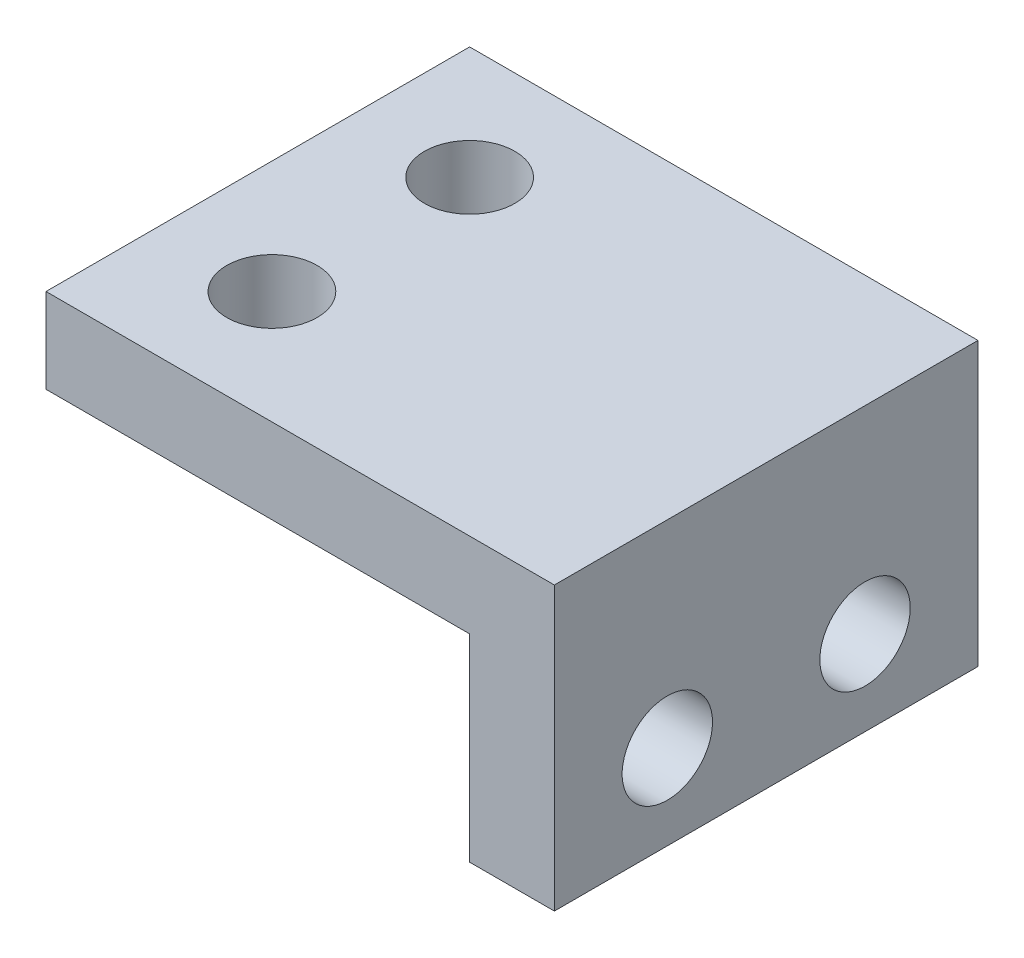
ISO-10303-21;
HEADER;
FILE_DESCRIPTION(('STEP AP214'),'2;1');
FILE_NAME('part.step','',(''),(''),'','','');
FILE_SCHEMA(('AUTOMOTIVE_DESIGN { 1 0 10303 214 1 1 1 1 }'));
ENDSEC;
DATA;
#1=APPLICATION_CONTEXT('core data for automotive mechanical design processes');
#2=APPLICATION_PROTOCOL_DEFINITION('international standard','automotive_design',2000,#1);
#3=PRODUCT_CONTEXT('',#1,'mechanical');
#4=PRODUCT('Part','Part','',(#3));
#5=PRODUCT_RELATED_PRODUCT_CATEGORY('part','',(#4));
#6=PRODUCT_DEFINITION_FORMATION('','',#4);
#7=PRODUCT_DEFINITION_CONTEXT('part definition',#1,'design');
#8=PRODUCT_DEFINITION('design','',#6,#7);
#9=PRODUCT_DEFINITION_SHAPE('','',#8);
#10=(LENGTH_UNIT() NAMED_UNIT(*) SI_UNIT(.MILLI.,.METRE.));
#11=(NAMED_UNIT(*) PLANE_ANGLE_UNIT() SI_UNIT($,.RADIAN.));
#12=(NAMED_UNIT(*) SI_UNIT($,.STERADIAN.) SOLID_ANGLE_UNIT());
#13=UNCERTAINTY_MEASURE_WITH_UNIT(LENGTH_MEASURE(1.E-05),#10,'distance_accuracy_value','');
#14=(GEOMETRIC_REPRESENTATION_CONTEXT(3) GLOBAL_UNCERTAINTY_ASSIGNED_CONTEXT((#13)) GLOBAL_UNIT_ASSIGNED_CONTEXT((#10,
#11,#12)) REPRESENTATION_CONTEXT('',''));
#15=CARTESIAN_POINT('',(0.,0.,0.));
#16=DIRECTION('',(0.,0.,1.));
#17=DIRECTION('',(1.,0.,0.));
#18=AXIS2_PLACEMENT_3D('',#15,#16,#17);
#19=CARTESIAN_POINT('',(0.,0.,7.5));
#20=DIRECTION('',(1.,0.,0.));
#21=DIRECTION('',(0.,1.,0.));
#22=AXIS2_PLACEMENT_3D('',#19,#20,#21);
#23=PLANE('',#22);
#24=CARTESIAN_POINT('',(0.,-4.,3.5));
#25=DIRECTION('',(1.,0.,0.));
#26=DIRECTION('',(0.,1.,0.));
#27=AXIS2_PLACEMENT_3D('',#24,#25,#26);
#28=CIRCLE('',#27,1.6);
#29=CARTESIAN_POINT('',(0.,-2.4,3.5));
#30=VERTEX_POINT('',#29);
#31=EDGE_CURVE('E150',#30,#30,#28,.T.);
#32=ORIENTED_EDGE('',*,*,#31,.T.);
#33=EDGE_LOOP('',(#32));
#34=FACE_BOUND('',#33,.T.);
#35=CARTESIAN_POINT('',(0.,-4.,-3.5));
#36=DIRECTION('',(1.,0.,0.));
#37=DIRECTION('',(0.,1.,0.));
#38=AXIS2_PLACEMENT_3D('',#35,#36,#37);
#39=CIRCLE('',#38,1.6);
#40=CARTESIAN_POINT('',(0.,-2.4,-3.5));
#41=VERTEX_POINT('',#40);
#42=EDGE_CURVE('E187',#41,#41,#39,.T.);
#43=ORIENTED_EDGE('',*,*,#42,.T.);
#44=EDGE_LOOP('',(#43));
#45=FACE_BOUND('',#44,.T.);
#46=DIRECTION('',(0.,-1.,0.));
#47=VECTOR('',#46,1.);
#48=CARTESIAN_POINT('',(0.,0.,-7.5));
#49=LINE('',#48,#47);
#50=CARTESIAN_POINT('',(0.,0.,-7.5));
#51=VERTEX_POINT('',#50);
#52=CARTESIAN_POINT('',(0.,-7.,-7.5));
#53=VERTEX_POINT('',#52);
#54=EDGE_CURVE('E123',#51,#53,#49,.T.);
#55=ORIENTED_EDGE('',*,*,#54,.T.);
#56=DIRECTION('',(0.,0.,-1.));
#57=VECTOR('',#56,1.);
#58=CARTESIAN_POINT('',(0.,-7.,7.5));
#59=LINE('',#58,#57);
#60=CARTESIAN_POINT('',(0.,-7.,7.5));
#61=VERTEX_POINT('',#60);
#62=EDGE_CURVE('E11',#61,#53,#59,.T.);
#63=ORIENTED_EDGE('',*,*,#62,.F.);
#64=DIRECTION('',(0.,-1.,0.));
#65=VECTOR('',#64,1.);
#66=CARTESIAN_POINT('',(0.,0.,7.5));
#67=LINE('',#66,#65);
#68=CARTESIAN_POINT('',(0.,0.,7.5));
#69=VERTEX_POINT('',#68);
#70=EDGE_CURVE('E133',#69,#61,#67,.T.);
#71=ORIENTED_EDGE('',*,*,#70,.F.);
#72=DIRECTION('',(0.,0.,-1.));
#73=VECTOR('',#72,1.);
#74=CARTESIAN_POINT('',(0.,0.,7.5));
#75=LINE('',#74,#73);
#76=EDGE_CURVE('E119',#69,#51,#75,.T.);
#77=ORIENTED_EDGE('',*,*,#76,.T.);
#78=EDGE_LOOP('',(#55,#63,#71,#77));
#79=FACE_BOUND('',#78,.T.);
#80=ADVANCED_FACE('F37',(#34,#45,#79),#23,.F.);
#81=CARTESIAN_POINT('',(0.,-7.,7.5));
#82=DIRECTION('',(0.,1.,0.));
#83=DIRECTION('',(0.,0.,1.));
#84=AXIS2_PLACEMENT_3D('',#81,#82,#83);
#85=PLANE('',#84);
#86=DIRECTION('',(1.,0.,0.));
#87=VECTOR('',#86,1.);
#88=CARTESIAN_POINT('',(0.,-7.,-7.5));
#89=LINE('',#88,#87);
#90=CARTESIAN_POINT('',(3.,-7.,-7.5));
#91=VERTEX_POINT('',#90);
#92=EDGE_CURVE('E126',#53,#91,#89,.T.);
#93=ORIENTED_EDGE('',*,*,#92,.T.);
#94=DIRECTION('',(0.,0.,-1.));
#95=VECTOR('',#94,1.);
#96=CARTESIAN_POINT('',(3.,-7.,7.5));
#97=LINE('',#96,#95);
#98=CARTESIAN_POINT('',(3.,-7.,7.5));
#99=VERTEX_POINT('',#98);
#100=EDGE_CURVE('E46',#99,#91,#97,.T.);
#101=ORIENTED_EDGE('',*,*,#100,.F.);
#102=DIRECTION('',(1.,0.,0.));
#103=VECTOR('',#102,1.);
#104=CARTESIAN_POINT('',(0.,-7.,7.5));
#105=LINE('',#104,#103);
#106=EDGE_CURVE('E92',#61,#99,#105,.T.);
#107=ORIENTED_EDGE('',*,*,#106,.F.);
#108=ORIENTED_EDGE('',*,*,#62,.T.);
#109=EDGE_LOOP('',(#93,#101,#107,#108));
#110=FACE_BOUND('',#109,.T.);
#111=ADVANCED_FACE('F158',(#110),#85,.F.);
#112=CARTESIAN_POINT('',(3.,-7.,7.5));
#113=DIRECTION('',(-1.,0.,0.));
#114=DIRECTION('',(0.,-1.,0.));
#115=AXIS2_PLACEMENT_3D('',#112,#113,#114);
#116=PLANE('',#115);
#117=CARTESIAN_POINT('',(3.,-4.,3.5));
#118=DIRECTION('',(1.,0.,0.));
#119=DIRECTION('',(0.,0.,-1.));
#120=AXIS2_PLACEMENT_3D('',#117,#118,#119);
#121=CIRCLE('',#120,1.6);
#122=CARTESIAN_POINT('',(3.,-4.,1.9));
#123=VERTEX_POINT('',#122);
#124=EDGE_CURVE('E189',#123,#123,#121,.T.);
#125=ORIENTED_EDGE('',*,*,#124,.F.);
#126=EDGE_LOOP('',(#125));
#127=FACE_BOUND('',#126,.T.);
#128=CARTESIAN_POINT('',(3.,-4.,-3.5));
#129=DIRECTION('',(1.,0.,0.));
#130=DIRECTION('',(0.,0.,-1.));
#131=AXIS2_PLACEMENT_3D('',#128,#129,#130);
#132=CIRCLE('',#131,1.6);
#133=CARTESIAN_POINT('',(3.,-4.,-5.1));
#134=VERTEX_POINT('',#133);
#135=EDGE_CURVE('E191',#134,#134,#132,.T.);
#136=ORIENTED_EDGE('',*,*,#135,.F.);
#137=EDGE_LOOP('',(#136));
#138=FACE_BOUND('',#137,.T.);
#139=DIRECTION('',(0.,1.,0.));
#140=VECTOR('',#139,1.);
#141=CARTESIAN_POINT('',(3.,-7.,-7.5));
#142=LINE('',#141,#140);
#143=CARTESIAN_POINT('',(3.,3.,-7.5));
#144=VERTEX_POINT('',#143);
#145=EDGE_CURVE('E128',#91,#144,#142,.T.);
#146=ORIENTED_EDGE('',*,*,#145,.T.);
#147=DIRECTION('',(0.,0.,-1.));
#148=VECTOR('',#147,1.);
#149=CARTESIAN_POINT('',(3.,3.,7.5));
#150=LINE('',#149,#148);
#151=CARTESIAN_POINT('',(3.,3.,7.5));
#152=VERTEX_POINT('',#151);
#153=EDGE_CURVE('E114',#152,#144,#150,.T.);
#154=ORIENTED_EDGE('',*,*,#153,.F.);
#155=DIRECTION('',(0.,1.,0.));
#156=VECTOR('',#155,1.);
#157=CARTESIAN_POINT('',(3.,-7.,7.5));
#158=LINE('',#157,#156);
#159=EDGE_CURVE('E105',#99,#152,#158,.T.);
#160=ORIENTED_EDGE('',*,*,#159,.F.);
#161=ORIENTED_EDGE('',*,*,#100,.T.);
#162=EDGE_LOOP('',(#146,#154,#160,#161));
#163=FACE_BOUND('',#162,.T.);
#164=ADVANCED_FACE('F161',(#127,#138,#163),#116,.F.);
#165=CARTESIAN_POINT('',(3.,3.,7.5));
#166=DIRECTION('',(0.,-1.,0.));
#167=DIRECTION('',(1.,0.,0.));
#168=AXIS2_PLACEMENT_3D('',#165,#166,#167);
#169=PLANE('',#168);
#170=CARTESIAN_POINT('',(-11.,3.,-3.5));
#171=DIRECTION('',(0.,1.,0.));
#172=DIRECTION('',(-1.,0.,0.));
#173=AXIS2_PLACEMENT_3D('',#170,#171,#172);
#174=CIRCLE('',#173,1.6);
#175=CARTESIAN_POINT('',(-12.6,3.,-3.5));
#176=VERTEX_POINT('',#175);
#177=EDGE_CURVE('E140',#176,#176,#174,.T.);
#178=ORIENTED_EDGE('',*,*,#177,.F.);
#179=EDGE_LOOP('',(#178));
#180=FACE_BOUND('',#179,.T.);
#181=CARTESIAN_POINT('',(-11.,3.,3.5));
#182=DIRECTION('',(0.,1.,0.));
#183=DIRECTION('',(-1.,0.,0.));
#184=AXIS2_PLACEMENT_3D('',#181,#182,#183);
#185=CIRCLE('',#184,1.6);
#186=CARTESIAN_POINT('',(-12.6,3.,3.5));
#187=VERTEX_POINT('',#186);
#188=EDGE_CURVE('E145',#187,#187,#185,.T.);
#189=ORIENTED_EDGE('',*,*,#188,.F.);
#190=EDGE_LOOP('',(#189));
#191=FACE_BOUND('',#190,.T.);
#192=DIRECTION('',(-1.,0.,0.));
#193=VECTOR('',#192,1.);
#194=CARTESIAN_POINT('',(3.,3.,-7.5));
#195=LINE('',#194,#193);
#196=CARTESIAN_POINT('',(-15.,3.,-7.5));
#197=VERTEX_POINT('',#196);
#198=EDGE_CURVE('E113',#144,#197,#195,.T.);
#199=ORIENTED_EDGE('',*,*,#198,.T.);
#200=DIRECTION('',(0.,0.,-1.));
#201=VECTOR('',#200,1.);
#202=CARTESIAN_POINT('',(-15.,3.,7.5));
#203=LINE('',#202,#201);
#204=CARTESIAN_POINT('',(-15.,3.,7.5));
#205=VERTEX_POINT('',#204);
#206=EDGE_CURVE('E110',#205,#197,#203,.T.);
#207=ORIENTED_EDGE('',*,*,#206,.F.);
#208=DIRECTION('',(-1.,0.,0.));
#209=VECTOR('',#208,1.);
#210=CARTESIAN_POINT('',(3.,3.,7.5));
#211=LINE('',#210,#209);
#212=EDGE_CURVE('E99',#152,#205,#211,.T.);
#213=ORIENTED_EDGE('',*,*,#212,.F.);
#214=ORIENTED_EDGE('',*,*,#153,.T.);
#215=EDGE_LOOP('',(#199,#207,#213,#214));
#216=FACE_BOUND('',#215,.T.);
#217=ADVANCED_FACE('F111',(#180,#191,#216),#169,.F.);
#218=CARTESIAN_POINT('',(-15.,3.,7.5));
#219=DIRECTION('',(1.,0.,0.));
#220=DIRECTION('',(0.,0.,-1.));
#221=AXIS2_PLACEMENT_3D('',#218,#219,#220);
#222=PLANE('',#221);
#223=DIRECTION('',(0.,-1.,0.));
#224=VECTOR('',#223,1.);
#225=CARTESIAN_POINT('',(-15.,3.,-7.5));
#226=LINE('',#225,#224);
#227=CARTESIAN_POINT('',(-15.,0.,-7.5));
#228=VERTEX_POINT('',#227);
#229=EDGE_CURVE('E78',#197,#228,#226,.T.);
#230=ORIENTED_EDGE('',*,*,#229,.T.);
#231=DIRECTION('',(0.,0.,-1.));
#232=VECTOR('',#231,1.);
#233=CARTESIAN_POINT('',(-15.,0.,7.5));
#234=LINE('',#233,#232);
#235=CARTESIAN_POINT('',(-15.,0.,7.5));
#236=VERTEX_POINT('',#235);
#237=EDGE_CURVE('E115',#236,#228,#234,.T.);
#238=ORIENTED_EDGE('',*,*,#237,.F.);
#239=DIRECTION('',(0.,-1.,0.));
#240=VECTOR('',#239,1.);
#241=CARTESIAN_POINT('',(-15.,3.,7.5));
#242=LINE('',#241,#240);
#243=EDGE_CURVE('E103',#205,#236,#242,.T.);
#244=ORIENTED_EDGE('',*,*,#243,.F.);
#245=ORIENTED_EDGE('',*,*,#206,.T.);
#246=EDGE_LOOP('',(#230,#238,#244,#245));
#247=FACE_BOUND('',#246,.T.);
#248=ADVANCED_FACE('F117',(#247),#222,.F.);
#249=CARTESIAN_POINT('',(0.,0.,7.5));
#250=DIRECTION('',(0.,1.,0.));
#251=DIRECTION('',(-1.,0.,0.));
#252=AXIS2_PLACEMENT_3D('',#249,#250,#251);
#253=PLANE('',#252);
#254=CARTESIAN_POINT('',(-11.,0.,-3.5));
#255=DIRECTION('',(0.,1.,0.));
#256=DIRECTION('',(-1.,0.,0.));
#257=AXIS2_PLACEMENT_3D('',#254,#255,#256);
#258=CIRCLE('',#257,1.6);
#259=CARTESIAN_POINT('',(-12.6,0.,-3.5));
#260=VERTEX_POINT('',#259);
#261=EDGE_CURVE('E40',#260,#260,#258,.T.);
#262=ORIENTED_EDGE('',*,*,#261,.T.);
#263=EDGE_LOOP('',(#262));
#264=FACE_BOUND('',#263,.T.);
#265=CARTESIAN_POINT('',(-11.,0.,3.5));
#266=DIRECTION('',(0.,1.,0.));
#267=DIRECTION('',(-1.,0.,0.));
#268=AXIS2_PLACEMENT_3D('',#265,#266,#267);
#269=CIRCLE('',#268,1.6);
#270=CARTESIAN_POINT('',(-12.6,0.,3.5));
#271=VERTEX_POINT('',#270);
#272=EDGE_CURVE('E138',#271,#271,#269,.T.);
#273=ORIENTED_EDGE('',*,*,#272,.T.);
#274=EDGE_LOOP('',(#273));
#275=FACE_BOUND('',#274,.T.);
#276=DIRECTION('',(1.,0.,0.));
#277=VECTOR('',#276,1.);
#278=CARTESIAN_POINT('',(0.,0.,-7.5));
#279=LINE('',#278,#277);
#280=EDGE_CURVE('E84',#228,#51,#279,.T.);
#281=ORIENTED_EDGE('',*,*,#280,.T.);
#282=ORIENTED_EDGE('',*,*,#76,.F.);
#283=DIRECTION('',(1.,0.,0.));
#284=VECTOR('',#283,1.);
#285=CARTESIAN_POINT('',(0.,0.,7.5));
#286=LINE('',#285,#284);
#287=EDGE_CURVE('E55',#236,#69,#286,.T.);
#288=ORIENTED_EDGE('',*,*,#287,.F.);
#289=ORIENTED_EDGE('',*,*,#237,.T.);
#290=EDGE_LOOP('',(#281,#282,#288,#289));
#291=FACE_BOUND('',#290,.T.);
#292=ADVANCED_FACE('F166',(#264,#275,#291),#253,.F.);
#293=CARTESIAN_POINT('',(0.,0.,7.5));
#294=DIRECTION('',(0.,0.,1.));
#295=DIRECTION('',(1.,0.,0.));
#296=AXIS2_PLACEMENT_3D('',#293,#294,#295);
#297=PLANE('',#296);
#298=ORIENTED_EDGE('',*,*,#70,.T.);
#299=ORIENTED_EDGE('',*,*,#106,.T.);
#300=ORIENTED_EDGE('',*,*,#159,.T.);
#301=ORIENTED_EDGE('',*,*,#212,.T.);
#302=ORIENTED_EDGE('',*,*,#243,.T.);
#303=ORIENTED_EDGE('',*,*,#287,.T.);
#304=EDGE_LOOP('',(#298,#299,#300,#301,#302,#303));
#305=FACE_BOUND('',#304,.T.);
#306=ADVANCED_FACE('F101',(#305),#297,.T.);
#307=CARTESIAN_POINT('',(0.,0.,-7.5));
#308=DIRECTION('',(0.,0.,1.));
#309=DIRECTION('',(1.,0.,0.));
#310=AXIS2_PLACEMENT_3D('',#307,#308,#309);
#311=PLANE('',#310);
#312=ORIENTED_EDGE('',*,*,#54,.F.);
#313=ORIENTED_EDGE('',*,*,#280,.F.);
#314=ORIENTED_EDGE('',*,*,#229,.F.);
#315=ORIENTED_EDGE('',*,*,#198,.F.);
#316=ORIENTED_EDGE('',*,*,#145,.F.);
#317=ORIENTED_EDGE('',*,*,#92,.F.);
#318=EDGE_LOOP('',(#312,#313,#314,#315,#316,#317));
#319=FACE_BOUND('',#318,.T.);
#320=ADVANCED_FACE('F164',(#319),#311,.F.);
#321=CARTESIAN_POINT('',(-11.,-12.,3.5));
#322=DIRECTION('',(0.,1.,0.));
#323=DIRECTION('',(-1.,0.,0.));
#324=AXIS2_PLACEMENT_3D('',#321,#322,#323);
#325=CYLINDRICAL_SURFACE('',#324,1.6);
#326=ORIENTED_EDGE('',*,*,#188,.T.);
#327=EDGE_LOOP('',(#326));
#328=FACE_BOUND('',#327,.T.);
#329=ORIENTED_EDGE('',*,*,#272,.F.);
#330=EDGE_LOOP('',(#329));
#331=FACE_BOUND('',#330,.T.);
#332=ADVANCED_FACE('F221',(#328,#331),#325,.F.);
#333=CARTESIAN_POINT('',(-11.,-12.,-3.5));
#334=DIRECTION('',(0.,1.,0.));
#335=DIRECTION('',(-1.,0.,0.));
#336=AXIS2_PLACEMENT_3D('',#333,#334,#335);
#337=CYLINDRICAL_SURFACE('',#336,1.6);
#338=ORIENTED_EDGE('',*,*,#177,.T.);
#339=EDGE_LOOP('',(#338));
#340=FACE_BOUND('',#339,.T.);
#341=ORIENTED_EDGE('',*,*,#261,.F.);
#342=EDGE_LOOP('',(#341));
#343=FACE_BOUND('',#342,.T.);
#344=ADVANCED_FACE('F216',(#340,#343),#337,.F.);
#345=CARTESIAN_POINT('',(-12.,-4.,-3.5));
#346=DIRECTION('',(1.,0.,0.));
#347=DIRECTION('',(0.,0.,-1.));
#348=AXIS2_PLACEMENT_3D('',#345,#346,#347);
#349=CYLINDRICAL_SURFACE('',#348,1.6);
#350=ORIENTED_EDGE('',*,*,#135,.T.);
#351=EDGE_LOOP('',(#350));
#352=FACE_BOUND('',#351,.T.);
#353=ORIENTED_EDGE('',*,*,#42,.F.);
#354=EDGE_LOOP('',(#353));
#355=FACE_BOUND('',#354,.T.);
#356=ADVANCED_FACE('F197',(#352,#355),#349,.F.);
#357=CARTESIAN_POINT('',(-12.,-4.,3.5));
#358=DIRECTION('',(1.,0.,0.));
#359=DIRECTION('',(0.,0.,-1.));
#360=AXIS2_PLACEMENT_3D('',#357,#358,#359);
#361=CYLINDRICAL_SURFACE('',#360,1.6);
#362=ORIENTED_EDGE('',*,*,#124,.T.);
#363=EDGE_LOOP('',(#362));
#364=FACE_BOUND('',#363,.T.);
#365=ORIENTED_EDGE('',*,*,#31,.F.);
#366=EDGE_LOOP('',(#365));
#367=FACE_BOUND('',#366,.T.);
#368=ADVANCED_FACE('F209',(#364,#367),#361,.F.);
#369=CLOSED_SHELL('',(#80,#111,#164,#217,#248,#292,#306,#320,#332,#344,#356,#368));
#370=MANIFOLD_SOLID_BREP('B2',#369);
#371=ADVANCED_BREP_SHAPE_REPRESENTATION('',(#18,#370),#14);
#372=SHAPE_DEFINITION_REPRESENTATION(#9,#371);
ENDSEC;
END-ISO-10303-21;
